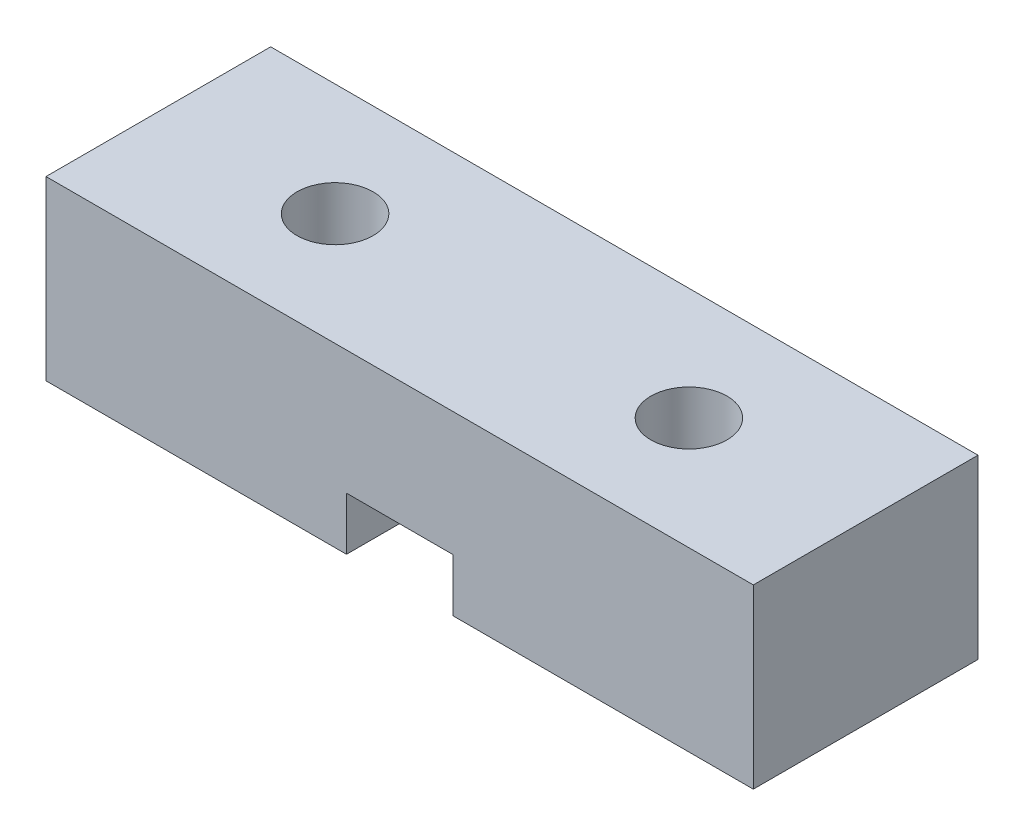
ISO-10303-21;
HEADER;
FILE_DESCRIPTION(('STEP AP214'),'2;1');
FILE_NAME('part.step','',(''),(''),'','','');
FILE_SCHEMA(('AUTOMOTIVE_DESIGN { 1 0 10303 214 1 1 1 1 }'));
ENDSEC;
DATA;
#1=APPLICATION_CONTEXT('core data for automotive mechanical design processes');
#2=APPLICATION_PROTOCOL_DEFINITION('international standard','automotive_design',2000,#1);
#3=PRODUCT_CONTEXT('',#1,'mechanical');
#4=PRODUCT('Part','Part','',(#3));
#5=PRODUCT_RELATED_PRODUCT_CATEGORY('part','',(#4));
#6=PRODUCT_DEFINITION_FORMATION('','',#4);
#7=PRODUCT_DEFINITION_CONTEXT('part definition',#1,'design');
#8=PRODUCT_DEFINITION('design','',#6,#7);
#9=PRODUCT_DEFINITION_SHAPE('','',#8);
#10=(LENGTH_UNIT() NAMED_UNIT(*) SI_UNIT(.MILLI.,.METRE.));
#11=(NAMED_UNIT(*) PLANE_ANGLE_UNIT() SI_UNIT($,.RADIAN.));
#12=(NAMED_UNIT(*) SI_UNIT($,.STERADIAN.) SOLID_ANGLE_UNIT());
#13=UNCERTAINTY_MEASURE_WITH_UNIT(LENGTH_MEASURE(1.E-05),#10,'distance_accuracy_value','');
#14=(GEOMETRIC_REPRESENTATION_CONTEXT(3) GLOBAL_UNCERTAINTY_ASSIGNED_CONTEXT((#13)) GLOBAL_UNIT_ASSIGNED_CONTEXT((#10,
#11,#12)) REPRESENTATION_CONTEXT('',''));
#15=CARTESIAN_POINT('',(0.,0.,0.));
#16=DIRECTION('',(0.,0.,1.));
#17=DIRECTION('',(1.,0.,0.));
#18=AXIS2_PLACEMENT_3D('',#15,#16,#17);
#19=CARTESIAN_POINT('',(0.,29.865,-12.7));
#20=DIRECTION('',(0.,-1.,0.));
#21=DIRECTION('',(0.,0.,-1.));
#22=AXIS2_PLACEMENT_3D('',#19,#20,#21);
#23=PLANE('',#22);
#24=CARTESIAN_POINT('',(25.,29.865,-6.35));
#25=DIRECTION('',(0.,-1.,0.));
#26=DIRECTION('',(0.,0.,-1.));
#27=AXIS2_PLACEMENT_3D('',#24,#25,#26);
#28=CIRCLE('',#27,2.15);
#29=CARTESIAN_POINT('',(25.,29.865,-8.5));
#30=VERTEX_POINT('',#29);
#31=EDGE_CURVE('E223',#30,#30,#28,.T.);
#32=ORIENTED_EDGE('',*,*,#31,.T.);
#33=EDGE_LOOP('',(#32));
#34=FACE_BOUND('',#33,.T.);
#35=CARTESIAN_POINT('',(45.,29.865,-6.35));
#36=DIRECTION('',(0.,-1.,0.));
#37=DIRECTION('',(0.,0.,-1.));
#38=AXIS2_PLACEMENT_3D('',#35,#36,#37);
#39=CIRCLE('',#38,2.15);
#40=CARTESIAN_POINT('',(45.,29.865,-8.5));
#41=VERTEX_POINT('',#40);
#42=EDGE_CURVE('E141',#41,#41,#39,.T.);
#43=ORIENTED_EDGE('',*,*,#42,.T.);
#44=EDGE_LOOP('',(#43));
#45=FACE_BOUND('',#44,.T.);
#46=DIRECTION('',(1.,0.,0.));
#47=VECTOR('',#46,1.);
#48=CARTESIAN_POINT('',(0.,29.865,0.));
#49=LINE('',#48,#47);
#50=CARTESIAN_POINT('',(15.01,29.865,0.));
#51=VERTEX_POINT('',#50);
#52=CARTESIAN_POINT('',(54.99,29.865,0.));
#53=VERTEX_POINT('',#52);
#54=EDGE_CURVE('E138',#51,#53,#49,.T.);
#55=ORIENTED_EDGE('',*,*,#54,.T.);
#56=DIRECTION('',(0.,0.,1.));
#57=VECTOR('',#56,1.);
#58=CARTESIAN_POINT('',(54.99,29.865,-12.7));
#59=LINE('',#58,#57);
#60=CARTESIAN_POINT('',(54.99,29.865,-12.7));
#61=VERTEX_POINT('',#60);
#62=EDGE_CURVE('E11',#61,#53,#59,.T.);
#63=ORIENTED_EDGE('',*,*,#62,.F.);
#64=DIRECTION('',(1.,0.,0.));
#65=VECTOR('',#64,1.);
#66=CARTESIAN_POINT('',(0.,29.865,-12.7));
#67=LINE('',#66,#65);
#68=CARTESIAN_POINT('',(15.01,29.865,-12.7));
#69=VERTEX_POINT('',#68);
#70=EDGE_CURVE('E60',#69,#61,#67,.T.);
#71=ORIENTED_EDGE('',*,*,#70,.F.);
#72=DIRECTION('',(0.,0.,1.));
#73=VECTOR('',#72,1.);
#74=CARTESIAN_POINT('',(15.01,29.865,-12.7));
#75=LINE('',#74,#73);
#76=EDGE_CURVE('E45',#69,#51,#75,.T.);
#77=ORIENTED_EDGE('',*,*,#76,.T.);
#78=EDGE_LOOP('',(#55,#63,#71,#77));
#79=FACE_BOUND('',#78,.T.);
#80=ADVANCED_FACE('F42',(#34,#45,#79),#23,.F.);
#81=CARTESIAN_POINT('',(54.99,0.,-12.7));
#82=DIRECTION('',(1.,0.,0.));
#83=DIRECTION('',(0.,0.,-1.));
#84=AXIS2_PLACEMENT_3D('',#81,#82,#83);
#85=PLANE('',#84);
#86=DIRECTION('',(0.,1.,0.));
#87=VECTOR('',#86,1.);
#88=CARTESIAN_POINT('',(54.99,0.,0.));
#89=LINE('',#88,#87);
#90=CARTESIAN_POINT('',(54.99,19.865,0.));
#91=VERTEX_POINT('',#90);
#92=EDGE_CURVE('E153',#91,#53,#89,.T.);
#93=ORIENTED_EDGE('',*,*,#92,.F.);
#94=DIRECTION('',(0.,0.,1.));
#95=VECTOR('',#94,1.);
#96=CARTESIAN_POINT('',(54.99,19.865,-12.7));
#97=LINE('',#96,#95);
#98=CARTESIAN_POINT('',(54.99,19.865,-12.7));
#99=VERTEX_POINT('',#98);
#100=EDGE_CURVE('E51',#99,#91,#97,.T.);
#101=ORIENTED_EDGE('',*,*,#100,.F.);
#102=DIRECTION('',(0.,1.,0.));
#103=VECTOR('',#102,1.);
#104=CARTESIAN_POINT('',(54.99,0.,-12.7));
#105=LINE('',#104,#103);
#106=EDGE_CURVE('E128',#99,#61,#105,.T.);
#107=ORIENTED_EDGE('',*,*,#106,.T.);
#108=ORIENTED_EDGE('',*,*,#62,.T.);
#109=EDGE_LOOP('',(#93,#101,#107,#108));
#110=FACE_BOUND('',#109,.T.);
#111=ADVANCED_FACE('F173',(#110),#85,.T.);
#112=CARTESIAN_POINT('',(0.,19.865,-12.7));
#113=DIRECTION('',(0.,-1.,0.));
#114=DIRECTION('',(0.,0.,-1.));
#115=AXIS2_PLACEMENT_3D('',#112,#113,#114);
#116=PLANE('',#115);
#117=CARTESIAN_POINT('',(45.,19.865,-6.35));
#118=DIRECTION('',(0.,-1.,0.));
#119=DIRECTION('',(0.,0.,-1.));
#120=AXIS2_PLACEMENT_3D('',#117,#118,#119);
#121=CIRCLE('',#120,2.15);
#122=CARTESIAN_POINT('',(45.,19.865,-8.5));
#123=VERTEX_POINT('',#122);
#124=EDGE_CURVE('E228',#123,#123,#121,.T.);
#125=ORIENTED_EDGE('',*,*,#124,.F.);
#126=EDGE_LOOP('',(#125));
#127=FACE_BOUND('',#126,.T.);
#128=DIRECTION('',(1.,0.,0.));
#129=VECTOR('',#128,1.);
#130=CARTESIAN_POINT('',(0.,19.865,0.));
#131=LINE('',#130,#129);
#132=CARTESIAN_POINT('',(38.005,19.865,0.));
#133=VERTEX_POINT('',#132);
#134=EDGE_CURVE('E116',#133,#91,#131,.T.);
#135=ORIENTED_EDGE('',*,*,#134,.F.);
#136=DIRECTION('',(0.,0.,1.));
#137=VECTOR('',#136,1.);
#138=CARTESIAN_POINT('',(38.005,19.865,-12.7));
#139=LINE('',#138,#137);
#140=CARTESIAN_POINT('',(38.005,19.865,-12.7));
#141=VERTEX_POINT('',#140);
#142=EDGE_CURVE('E112',#141,#133,#139,.T.);
#143=ORIENTED_EDGE('',*,*,#142,.F.);
#144=DIRECTION('',(1.,0.,0.));
#145=VECTOR('',#144,1.);
#146=CARTESIAN_POINT('',(0.,19.865,-12.7));
#147=LINE('',#146,#145);
#148=EDGE_CURVE('E115',#141,#99,#147,.T.);
#149=ORIENTED_EDGE('',*,*,#148,.T.);
#150=ORIENTED_EDGE('',*,*,#100,.T.);
#151=EDGE_LOOP('',(#135,#143,#149,#150));
#152=FACE_BOUND('',#151,.T.);
#153=ADVANCED_FACE('F114',(#127,#152),#116,.T.);
#154=CARTESIAN_POINT('',(38.005,0.,-12.7));
#155=DIRECTION('',(-1.,0.,0.));
#156=DIRECTION('',(0.,0.,1.));
#157=AXIS2_PLACEMENT_3D('',#154,#155,#156);
#158=PLANE('',#157);
#159=DIRECTION('',(0.,-1.,0.));
#160=VECTOR('',#159,1.);
#161=CARTESIAN_POINT('',(38.005,0.,0.));
#162=LINE('',#161,#160);
#163=CARTESIAN_POINT('',(38.005,22.86,0.));
#164=VERTEX_POINT('',#163);
#165=EDGE_CURVE('E150',#164,#133,#162,.T.);
#166=ORIENTED_EDGE('',*,*,#165,.F.);
#167=DIRECTION('',(0.,0.,1.));
#168=VECTOR('',#167,1.);
#169=CARTESIAN_POINT('',(38.005,22.86,-12.7));
#170=LINE('',#169,#168);
#171=CARTESIAN_POINT('',(38.005,22.86,-12.7));
#172=VERTEX_POINT('',#171);
#173=EDGE_CURVE('E121',#172,#164,#170,.T.);
#174=ORIENTED_EDGE('',*,*,#173,.F.);
#175=DIRECTION('',(0.,-1.,0.));
#176=VECTOR('',#175,1.);
#177=CARTESIAN_POINT('',(38.005,0.,-12.7));
#178=LINE('',#177,#176);
#179=EDGE_CURVE('E126',#172,#141,#178,.T.);
#180=ORIENTED_EDGE('',*,*,#179,.T.);
#181=ORIENTED_EDGE('',*,*,#142,.T.);
#182=EDGE_LOOP('',(#166,#174,#180,#181));
#183=FACE_BOUND('',#182,.T.);
#184=ADVANCED_FACE('F130',(#183),#158,.T.);
#185=CARTESIAN_POINT('',(0.,22.86,-12.7));
#186=DIRECTION('',(0.,-1.,0.));
#187=DIRECTION('',(0.,0.,-1.));
#188=AXIS2_PLACEMENT_3D('',#185,#186,#187);
#189=PLANE('',#188);
#190=DIRECTION('',(1.,0.,0.));
#191=VECTOR('',#190,1.);
#192=CARTESIAN_POINT('',(0.,22.86,0.));
#193=LINE('',#192,#191);
#194=CARTESIAN_POINT('',(31.995,22.86,0.));
#195=VERTEX_POINT('',#194);
#196=EDGE_CURVE('E147',#195,#164,#193,.T.);
#197=ORIENTED_EDGE('',*,*,#196,.F.);
#198=DIRECTION('',(0.,0.,1.));
#199=VECTOR('',#198,1.);
#200=CARTESIAN_POINT('',(31.995,22.86,-12.7));
#201=LINE('',#200,#199);
#202=CARTESIAN_POINT('',(31.995,22.86,-12.7));
#203=VERTEX_POINT('',#202);
#204=EDGE_CURVE('E158',#203,#195,#201,.T.);
#205=ORIENTED_EDGE('',*,*,#204,.F.);
#206=DIRECTION('',(1.,0.,0.));
#207=VECTOR('',#206,1.);
#208=CARTESIAN_POINT('',(0.,22.86,-12.7));
#209=LINE('',#208,#207);
#210=EDGE_CURVE('E131',#203,#172,#209,.T.);
#211=ORIENTED_EDGE('',*,*,#210,.T.);
#212=ORIENTED_EDGE('',*,*,#173,.T.);
#213=EDGE_LOOP('',(#197,#205,#211,#212));
#214=FACE_BOUND('',#213,.T.);
#215=ADVANCED_FACE('F190',(#214),#189,.T.);
#216=CARTESIAN_POINT('',(31.995,0.,-12.7));
#217=DIRECTION('',(-1.,0.,0.));
#218=DIRECTION('',(0.,0.,1.));
#219=AXIS2_PLACEMENT_3D('',#216,#217,#218);
#220=PLANE('',#219);
#221=DIRECTION('',(0.,-1.,0.));
#222=VECTOR('',#221,1.);
#223=CARTESIAN_POINT('',(31.995,0.,0.));
#224=LINE('',#223,#222);
#225=CARTESIAN_POINT('',(31.995,19.865,0.));
#226=VERTEX_POINT('',#225);
#227=EDGE_CURVE('E145',#195,#226,#224,.T.);
#228=ORIENTED_EDGE('',*,*,#227,.T.);
#229=DIRECTION('',(0.,0.,1.));
#230=VECTOR('',#229,1.);
#231=CARTESIAN_POINT('',(31.995,19.865,-12.7));
#232=LINE('',#231,#230);
#233=CARTESIAN_POINT('',(31.995,19.865,-12.7));
#234=VERTEX_POINT('',#233);
#235=EDGE_CURVE('E160',#234,#226,#232,.T.);
#236=ORIENTED_EDGE('',*,*,#235,.F.);
#237=DIRECTION('',(0.,-1.,0.));
#238=VECTOR('',#237,1.);
#239=CARTESIAN_POINT('',(31.995,0.,-12.7));
#240=LINE('',#239,#238);
#241=EDGE_CURVE('E133',#203,#234,#240,.T.);
#242=ORIENTED_EDGE('',*,*,#241,.F.);
#243=ORIENTED_EDGE('',*,*,#204,.T.);
#244=EDGE_LOOP('',(#228,#236,#242,#243));
#245=FACE_BOUND('',#244,.T.);
#246=ADVANCED_FACE('F193',(#245),#220,.F.);
#247=CARTESIAN_POINT('',(0.,19.865,-12.7));
#248=DIRECTION('',(0.,1.,0.));
#249=DIRECTION('',(0.,0.,1.));
#250=AXIS2_PLACEMENT_3D('',#247,#248,#249);
#251=PLANE('',#250);
#252=CARTESIAN_POINT('',(25.,19.865,-6.35));
#253=DIRECTION('',(0.,-1.,0.));
#254=DIRECTION('',(0.,0.,-1.));
#255=AXIS2_PLACEMENT_3D('',#252,#253,#254);
#256=CIRCLE('',#255,2.15);
#257=CARTESIAN_POINT('',(25.,19.865,-8.49999999999999));
#258=VERTEX_POINT('',#257);
#259=EDGE_CURVE('E226',#258,#258,#256,.T.);
#260=ORIENTED_EDGE('',*,*,#259,.F.);
#261=EDGE_LOOP('',(#260));
#262=FACE_BOUND('',#261,.T.);
#263=DIRECTION('',(-1.,0.,0.));
#264=VECTOR('',#263,1.);
#265=CARTESIAN_POINT('',(0.,19.865,0.));
#266=LINE('',#265,#264);
#267=CARTESIAN_POINT('',(15.01,19.865,0.));
#268=VERTEX_POINT('',#267);
#269=EDGE_CURVE('E143',#226,#268,#266,.T.);
#270=ORIENTED_EDGE('',*,*,#269,.T.);
#271=DIRECTION('',(0.,0.,1.));
#272=VECTOR('',#271,1.);
#273=CARTESIAN_POINT('',(15.01,19.865,-12.7));
#274=LINE('',#273,#272);
#275=CARTESIAN_POINT('',(15.01,19.865,-12.7));
#276=VERTEX_POINT('',#275);
#277=EDGE_CURVE('E162',#276,#268,#274,.T.);
#278=ORIENTED_EDGE('',*,*,#277,.F.);
#279=DIRECTION('',(-1.,0.,0.));
#280=VECTOR('',#279,1.);
#281=CARTESIAN_POINT('',(0.,19.865,-12.7));
#282=LINE('',#281,#280);
#283=EDGE_CURVE('E237',#234,#276,#282,.T.);
#284=ORIENTED_EDGE('',*,*,#283,.F.);
#285=ORIENTED_EDGE('',*,*,#235,.T.);
#286=EDGE_LOOP('',(#270,#278,#284,#285));
#287=FACE_BOUND('',#286,.T.);
#288=ADVANCED_FACE('F197',(#262,#287),#251,.F.);
#289=CARTESIAN_POINT('',(15.01,0.,-12.7));
#290=DIRECTION('',(1.,0.,0.));
#291=DIRECTION('',(0.,0.,-1.));
#292=AXIS2_PLACEMENT_3D('',#289,#290,#291);
#293=PLANE('',#292);
#294=DIRECTION('',(0.,1.,0.));
#295=VECTOR('',#294,1.);
#296=CARTESIAN_POINT('',(15.01,0.,0.));
#297=LINE('',#296,#295);
#298=EDGE_CURVE('E140',#268,#51,#297,.T.);
#299=ORIENTED_EDGE('',*,*,#298,.T.);
#300=ORIENTED_EDGE('',*,*,#76,.F.);
#301=DIRECTION('',(0.,1.,0.));
#302=VECTOR('',#301,1.);
#303=CARTESIAN_POINT('',(15.01,0.,-12.7));
#304=LINE('',#303,#302);
#305=EDGE_CURVE('E99',#276,#69,#304,.T.);
#306=ORIENTED_EDGE('',*,*,#305,.F.);
#307=ORIENTED_EDGE('',*,*,#277,.T.);
#308=EDGE_LOOP('',(#299,#300,#306,#307));
#309=FACE_BOUND('',#308,.T.);
#310=ADVANCED_FACE('F200',(#309),#293,.F.);
#311=CARTESIAN_POINT('',(0.,0.,-12.7));
#312=DIRECTION('',(0.,0.,1.));
#313=DIRECTION('',(1.,0.,0.));
#314=AXIS2_PLACEMENT_3D('',#311,#312,#313);
#315=PLANE('',#314);
#316=ORIENTED_EDGE('',*,*,#70,.T.);
#317=ORIENTED_EDGE('',*,*,#106,.F.);
#318=ORIENTED_EDGE('',*,*,#148,.F.);
#319=ORIENTED_EDGE('',*,*,#179,.F.);
#320=ORIENTED_EDGE('',*,*,#210,.F.);
#321=ORIENTED_EDGE('',*,*,#241,.T.);
#322=ORIENTED_EDGE('',*,*,#283,.T.);
#323=ORIENTED_EDGE('',*,*,#305,.T.);
#324=EDGE_LOOP('',(#316,#317,#318,#319,#320,#321,#322,#323));
#325=FACE_BOUND('',#324,.T.);
#326=ADVANCED_FACE('F124',(#325),#315,.F.);
#327=CARTESIAN_POINT('',(0.,0.,0.));
#328=DIRECTION('',(0.,0.,1.));
#329=DIRECTION('',(1.,0.,0.));
#330=AXIS2_PLACEMENT_3D('',#327,#328,#329);
#331=PLANE('',#330);
#332=ORIENTED_EDGE('',*,*,#54,.F.);
#333=ORIENTED_EDGE('',*,*,#298,.F.);
#334=ORIENTED_EDGE('',*,*,#269,.F.);
#335=ORIENTED_EDGE('',*,*,#227,.F.);
#336=ORIENTED_EDGE('',*,*,#196,.T.);
#337=ORIENTED_EDGE('',*,*,#165,.T.);
#338=ORIENTED_EDGE('',*,*,#134,.T.);
#339=ORIENTED_EDGE('',*,*,#92,.T.);
#340=EDGE_LOOP('',(#332,#333,#334,#335,#336,#337,#338,#339));
#341=FACE_BOUND('',#340,.T.);
#342=ADVANCED_FACE('F171',(#341),#331,.T.);
#343=CARTESIAN_POINT('',(45.,19.865,-6.35));
#344=DIRECTION('',(0.,-1.,0.));
#345=DIRECTION('',(0.,0.,-1.));
#346=AXIS2_PLACEMENT_3D('',#343,#344,#345);
#347=CYLINDRICAL_SURFACE('',#346,2.15);
#348=ORIENTED_EDGE('',*,*,#42,.F.);
#349=EDGE_LOOP('',(#348));
#350=FACE_BOUND('',#349,.T.);
#351=ORIENTED_EDGE('',*,*,#124,.T.);
#352=EDGE_LOOP('',(#351));
#353=FACE_BOUND('',#352,.T.);
#354=ADVANCED_FACE('F210',(#350,#353),#347,.F.);
#355=CARTESIAN_POINT('',(25.,19.865,-6.35));
#356=DIRECTION('',(0.,-1.,0.));
#357=DIRECTION('',(0.,0.,-1.));
#358=AXIS2_PLACEMENT_3D('',#355,#356,#357);
#359=CYLINDRICAL_SURFACE('',#358,2.15);
#360=ORIENTED_EDGE('',*,*,#31,.F.);
#361=EDGE_LOOP('',(#360));
#362=FACE_BOUND('',#361,.T.);
#363=ORIENTED_EDGE('',*,*,#259,.T.);
#364=EDGE_LOOP('',(#363));
#365=FACE_BOUND('',#364,.T.);
#366=ADVANCED_FACE('F214',(#362,#365),#359,.F.);
#367=CLOSED_SHELL('',(#80,#111,#153,#184,#215,#246,#288,#310,#326,#342,#354,#366));
#368=MANIFOLD_SOLID_BREP('B2',#367);
#369=ADVANCED_BREP_SHAPE_REPRESENTATION('',(#18,#368),#14);
#370=SHAPE_DEFINITION_REPRESENTATION(#9,#369);
ENDSEC;
END-ISO-10303-21;
